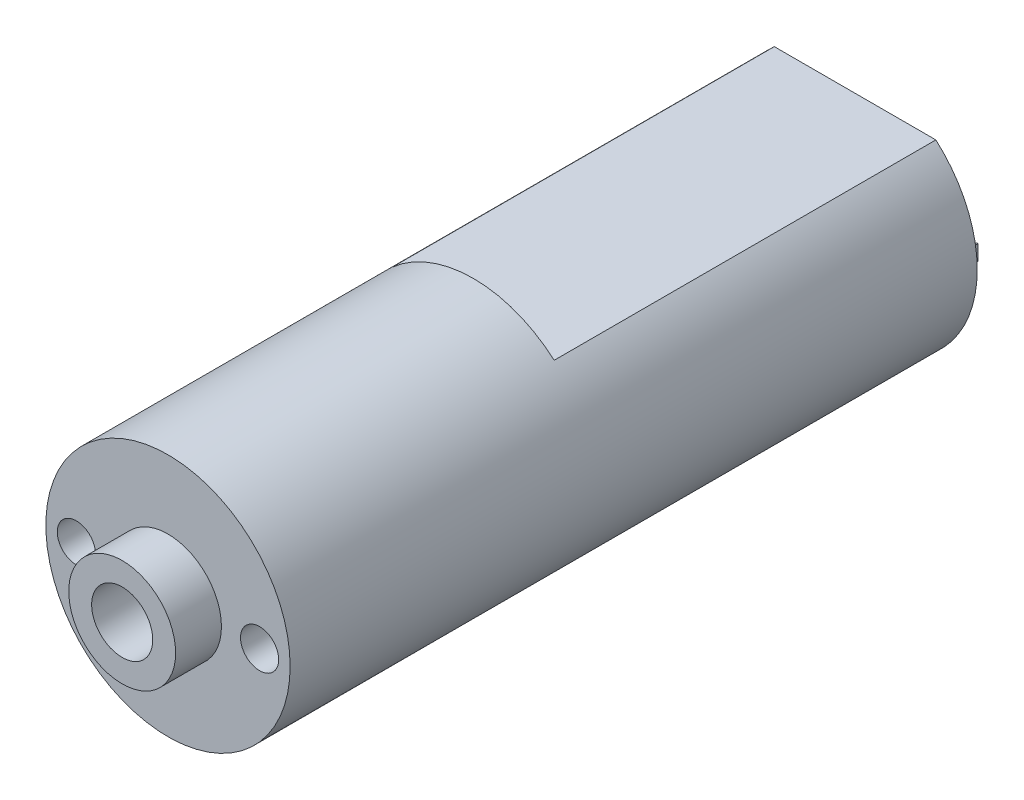
ISO-10303-21;
HEADER;
FILE_DESCRIPTION(('STEP AP214'),'2;1');
FILE_NAME('part.step','',(''),(''),'','','');
FILE_SCHEMA(('AUTOMOTIVE_DESIGN { 1 0 10303 214 1 1 1 1 }'));
ENDSEC;
DATA;
#1=APPLICATION_CONTEXT('core data for automotive mechanical design processes');
#2=APPLICATION_PROTOCOL_DEFINITION('international standard','automotive_design',2000,#1);
#3=PRODUCT_CONTEXT('',#1,'mechanical');
#4=PRODUCT('Part','Part','',(#3));
#5=PRODUCT_RELATED_PRODUCT_CATEGORY('part','',(#4));
#6=PRODUCT_DEFINITION_FORMATION('','',#4);
#7=PRODUCT_DEFINITION_CONTEXT('part definition',#1,'design');
#8=PRODUCT_DEFINITION('design','',#6,#7);
#9=PRODUCT_DEFINITION_SHAPE('','',#8);
#10=(LENGTH_UNIT() NAMED_UNIT(*) SI_UNIT(.MILLI.,.METRE.));
#11=(NAMED_UNIT(*) PLANE_ANGLE_UNIT() SI_UNIT($,.RADIAN.));
#12=(NAMED_UNIT(*) SI_UNIT($,.STERADIAN.) SOLID_ANGLE_UNIT());
#13=UNCERTAINTY_MEASURE_WITH_UNIT(LENGTH_MEASURE(1.E-05),#10,'distance_accuracy_value','');
#14=(GEOMETRIC_REPRESENTATION_CONTEXT(3) GLOBAL_UNCERTAINTY_ASSIGNED_CONTEXT((#13)) GLOBAL_UNIT_ASSIGNED_CONTEXT((#10,
#11,#12)) REPRESENTATION_CONTEXT('',''));
#15=CARTESIAN_POINT('',(0.,0.,0.));
#16=DIRECTION('',(0.,0.,1.));
#17=DIRECTION('',(1.,0.,0.));
#18=AXIS2_PLACEMENT_3D('',#15,#16,#17);
#19=CARTESIAN_POINT('',(0.,0.,-45.));
#20=DIRECTION('',(0.,0.,-1.));
#21=DIRECTION('',(-1.,0.,0.));
#22=AXIS2_PLACEMENT_3D('',#19,#20,#21);
#23=PLANE('',#22);
#24=CARTESIAN_POINT('',(0.,0.,-45.));
#25=DIRECTION('',(0.,0.,-1.));
#26=DIRECTION('',(-1.,0.,0.));
#27=AXIS2_PLACEMENT_3D('',#24,#25,#26);
#28=CIRCLE('',#27,2.);
#29=CARTESIAN_POINT('',(-2.,0.,-45.));
#30=VERTEX_POINT('',#29);
#31=EDGE_CURVE('E44',#30,#30,#28,.T.);
#32=ORIENTED_EDGE('',*,*,#31,.F.);
#33=EDGE_LOOP('',(#32));
#34=FACE_BOUND('',#33,.T.);
#35=CARTESIAN_POINT('',(0.,0.,-45.));
#36=DIRECTION('',(0.,0.,-1.));
#37=DIRECTION('',(-1.,0.,0.));
#38=AXIS2_PLACEMENT_3D('',#35,#36,#37);
#39=CIRCLE('',#38,8.);
#40=CARTESIAN_POINT('',(5.29150262212918,6.,-45.));
#41=VERTEX_POINT('',#40);
#42=CARTESIAN_POINT('',(5.29150262212918,-6.,-45.));
#43=VERTEX_POINT('',#42);
#44=EDGE_CURVE('E186',#41,#43,#39,.T.);
#45=ORIENTED_EDGE('',*,*,#44,.T.);
#46=DIRECTION('',(-1.,0.,0.));
#47=VECTOR('',#46,1.);
#48=CARTESIAN_POINT('',(5.29150262212918,-6.,-45.));
#49=LINE('',#48,#47);
#50=CARTESIAN_POINT('',(-5.29150262212918,-6.,-45.));
#51=VERTEX_POINT('',#50);
#52=EDGE_CURVE('E189',#43,#51,#49,.T.);
#53=ORIENTED_EDGE('',*,*,#52,.T.);
#54=CARTESIAN_POINT('',(0.,0.,-45.));
#55=DIRECTION('',(0.,0.,-1.));
#56=DIRECTION('',(-1.,0.,0.));
#57=AXIS2_PLACEMENT_3D('',#54,#55,#56);
#58=CIRCLE('',#57,8.);
#59=CARTESIAN_POINT('',(-5.29150262212918,6.00000000000001,-45.));
#60=VERTEX_POINT('',#59);
#61=EDGE_CURVE('E192',#51,#60,#58,.T.);
#62=ORIENTED_EDGE('',*,*,#61,.T.);
#63=DIRECTION('',(1.,0.,0.));
#64=VECTOR('',#63,1.);
#65=CARTESIAN_POINT('',(5.29150262212918,6.,-45.));
#66=LINE('',#65,#64);
#67=EDGE_CURVE('E194',#60,#41,#66,.T.);
#68=ORIENTED_EDGE('',*,*,#67,.T.);
#69=EDGE_LOOP('',(#45,#53,#62,#68));
#70=FACE_BOUND('',#69,.T.);
#71=DIRECTION('',(1.,0.,0.));
#72=VECTOR('',#71,1.);
#73=CARTESIAN_POINT('',(-6.95,0.5,-45.));
#74=LINE('',#73,#72);
#75=CARTESIAN_POINT('',(-7.05,0.5,-45.));
#76=VERTEX_POINT('',#75);
#77=CARTESIAN_POINT('',(-6.95,0.5,-45.));
#78=VERTEX_POINT('',#77);
#79=EDGE_CURVE('E154',#76,#78,#74,.T.);
#80=ORIENTED_EDGE('',*,*,#79,.F.);
#81=DIRECTION('',(0.,1.,0.));
#82=VECTOR('',#81,1.);
#83=CARTESIAN_POINT('',(-7.05,0.5,-45.));
#84=LINE('',#83,#82);
#85=CARTESIAN_POINT('',(-7.05,-0.5,-45.));
#86=VERTEX_POINT('',#85);
#87=EDGE_CURVE('E151',#86,#76,#84,.T.);
#88=ORIENTED_EDGE('',*,*,#87,.F.);
#89=DIRECTION('',(-1.,0.,0.));
#90=VECTOR('',#89,1.);
#91=CARTESIAN_POINT('',(-6.95,-0.5,-45.));
#92=LINE('',#91,#90);
#93=CARTESIAN_POINT('',(-6.95,-0.5,-45.));
#94=VERTEX_POINT('',#93);
#95=EDGE_CURVE('E163',#94,#86,#92,.T.);
#96=ORIENTED_EDGE('',*,*,#95,.F.);
#97=DIRECTION('',(0.,-1.,0.));
#98=VECTOR('',#97,1.);
#99=CARTESIAN_POINT('',(-6.95,0.5,-45.));
#100=LINE('',#99,#98);
#101=EDGE_CURVE('E171',#78,#94,#100,.T.);
#102=ORIENTED_EDGE('',*,*,#101,.F.);
#103=EDGE_LOOP('',(#80,#88,#96,#102));
#104=FACE_BOUND('',#103,.T.);
#105=DIRECTION('',(1.,0.,0.));
#106=VECTOR('',#105,1.);
#107=CARTESIAN_POINT('',(6.95,0.5,-45.));
#108=LINE('',#107,#106);
#109=CARTESIAN_POINT('',(6.95,0.5,-45.));
#110=VERTEX_POINT('',#109);
#111=CARTESIAN_POINT('',(7.05,0.5,-45.));
#112=VERTEX_POINT('',#111);
#113=EDGE_CURVE('E552',#110,#112,#108,.T.);
#114=ORIENTED_EDGE('',*,*,#113,.F.);
#115=DIRECTION('',(0.,1.,0.));
#116=VECTOR('',#115,1.);
#117=CARTESIAN_POINT('',(6.95,0.5,-45.));
#118=LINE('',#117,#116);
#119=CARTESIAN_POINT('',(6.95,-0.5,-45.));
#120=VERTEX_POINT('',#119);
#121=EDGE_CURVE('E149',#120,#110,#118,.T.);
#122=ORIENTED_EDGE('',*,*,#121,.F.);
#123=DIRECTION('',(-1.,0.,0.));
#124=VECTOR('',#123,1.);
#125=CARTESIAN_POINT('',(6.95,-0.5,-45.));
#126=LINE('',#125,#124);
#127=CARTESIAN_POINT('',(7.05,-0.5,-45.));
#128=VERTEX_POINT('',#127);
#129=EDGE_CURVE('E145',#128,#120,#126,.T.);
#130=ORIENTED_EDGE('',*,*,#129,.F.);
#131=DIRECTION('',(0.,-1.,0.));
#132=VECTOR('',#131,1.);
#133=CARTESIAN_POINT('',(7.05,0.5,-45.));
#134=LINE('',#133,#132);
#135=EDGE_CURVE('E549',#112,#128,#134,.T.);
#136=ORIENTED_EDGE('',*,*,#135,.F.);
#137=EDGE_LOOP('',(#114,#122,#130,#136));
#138=FACE_BOUND('',#137,.T.);
#139=ADVANCED_FACE('F36',(#34,#70,#104,#138),#23,.T.);
#140=CARTESIAN_POINT('',(0.,0.,-20.));
#141=DIRECTION('',(0.,0.,1.));
#142=DIRECTION('',(1.,0.,0.));
#143=AXIS2_PLACEMENT_3D('',#140,#141,#142);
#144=PLANE('',#143);
#145=DIRECTION('',(1.,0.,0.));
#146=VECTOR('',#145,1.);
#147=CARTESIAN_POINT('',(5.29150262212918,6.,-20.));
#148=LINE('',#147,#146);
#149=CARTESIAN_POINT('',(-5.29150262212917,6.00000000000001,-20.));
#150=VERTEX_POINT('',#149);
#151=CARTESIAN_POINT('',(5.29150262212918,6.,-20.));
#152=VERTEX_POINT('',#151);
#153=EDGE_CURVE('E190',#150,#152,#148,.T.);
#154=ORIENTED_EDGE('',*,*,#153,.F.);
#155=CARTESIAN_POINT('',(0.,0.,-20.));
#156=DIRECTION('',(0.,0.,1.));
#157=DIRECTION('',(1.,0.,0.));
#158=AXIS2_PLACEMENT_3D('',#155,#156,#157);
#159=CIRCLE('',#158,8.);
#160=EDGE_CURVE('E185',#152,#150,#159,.T.);
#161=ORIENTED_EDGE('',*,*,#160,.F.);
#162=EDGE_LOOP('',(#154,#161));
#163=FACE_BOUND('',#162,.T.);
#164=ADVANCED_FACE('F260',(#163),#144,.F.);
#165=DIRECTION('',(-1.,0.,0.));
#166=VECTOR('',#165,1.);
#167=CARTESIAN_POINT('',(5.29150262212918,-6.,-20.));
#168=LINE('',#167,#166);
#169=CARTESIAN_POINT('',(5.29150262212918,-6.,-20.));
#170=VERTEX_POINT('',#169);
#171=CARTESIAN_POINT('',(-5.29150262212918,-6.,-20.));
#172=VERTEX_POINT('',#171);
#173=EDGE_CURVE('E182',#170,#172,#168,.T.);
#174=ORIENTED_EDGE('',*,*,#173,.F.);
#175=EDGE_CURVE('E232',#172,#170,#159,.T.);
#176=ORIENTED_EDGE('',*,*,#175,.F.);
#177=EDGE_LOOP('',(#174,#176));
#178=FACE_BOUND('',#177,.T.);
#179=ADVANCED_FACE('F266',(#178),#144,.F.);
#180=CARTESIAN_POINT('',(-6.,0.,-20.));
#181=DIRECTION('',(0.,0.,1.));
#182=DIRECTION('',(1.,0.,0.));
#183=AXIS2_PLACEMENT_3D('',#180,#181,#182);
#184=CYLINDRICAL_SURFACE('',#183,1.25);
#185=CARTESIAN_POINT('',(-6.,0.,-20.));
#186=DIRECTION('',(0.,0.,1.));
#187=DIRECTION('',(1.,0.,0.));
#188=AXIS2_PLACEMENT_3D('',#185,#186,#187);
#189=CIRCLE('',#188,1.25);
#190=CARTESIAN_POINT('',(-4.75,0.,-20.));
#191=VERTEX_POINT('',#190);
#192=EDGE_CURVE('E229',#191,#191,#189,.T.);
#193=ORIENTED_EDGE('',*,*,#192,.F.);
#194=EDGE_LOOP('',(#193));
#195=FACE_BOUND('',#194,.T.);
#196=CARTESIAN_POINT('',(-6.,0.,0.));
#197=DIRECTION('',(0.,0.,1.));
#198=DIRECTION('',(1.,0.,0.));
#199=AXIS2_PLACEMENT_3D('',#196,#197,#198);
#200=CIRCLE('',#199,1.25);
#201=CARTESIAN_POINT('',(-4.75,0.,0.));
#202=VERTEX_POINT('',#201);
#203=EDGE_CURVE('E237',#202,#202,#200,.T.);
#204=ORIENTED_EDGE('',*,*,#203,.T.);
#205=EDGE_LOOP('',(#204));
#206=FACE_BOUND('',#205,.T.);
#207=ADVANCED_FACE('F305',(#195,#206),#184,.F.);
#208=CARTESIAN_POINT('',(6.,0.,-20.));
#209=DIRECTION('',(0.,0.,1.));
#210=DIRECTION('',(1.,0.,0.));
#211=AXIS2_PLACEMENT_3D('',#208,#209,#210);
#212=CYLINDRICAL_SURFACE('',#211,1.25);
#213=CARTESIAN_POINT('',(6.,0.,-20.));
#214=DIRECTION('',(0.,0.,1.));
#215=DIRECTION('',(1.,0.,0.));
#216=AXIS2_PLACEMENT_3D('',#213,#214,#215);
#217=CIRCLE('',#216,1.25);
#218=CARTESIAN_POINT('',(7.25,0.,-20.));
#219=VERTEX_POINT('',#218);
#220=EDGE_CURVE('E225',#219,#219,#217,.T.);
#221=ORIENTED_EDGE('',*,*,#220,.F.);
#222=EDGE_LOOP('',(#221));
#223=FACE_BOUND('',#222,.T.);
#224=CARTESIAN_POINT('',(6.,0.,0.));
#225=DIRECTION('',(0.,0.,1.));
#226=DIRECTION('',(1.,0.,0.));
#227=AXIS2_PLACEMENT_3D('',#224,#225,#226);
#228=CIRCLE('',#227,1.25);
#229=CARTESIAN_POINT('',(7.25,0.,0.));
#230=VERTEX_POINT('',#229);
#231=EDGE_CURVE('E219',#230,#230,#228,.T.);
#232=ORIENTED_EDGE('',*,*,#231,.T.);
#233=EDGE_LOOP('',(#232));
#234=FACE_BOUND('',#233,.T.);
#235=ADVANCED_FACE('F256',(#223,#234),#212,.F.);
#236=CARTESIAN_POINT('',(0.,0.,-20.));
#237=DIRECTION('',(0.,0.,1.));
#238=DIRECTION('',(1.,0.,0.));
#239=AXIS2_PLACEMENT_3D('',#236,#237,#238);
#240=CYLINDRICAL_SURFACE('',#239,2.);
#241=CARTESIAN_POINT('',(0.,0.,-20.));
#242=DIRECTION('',(0.,0.,1.));
#243=DIRECTION('',(1.,0.,0.));
#244=AXIS2_PLACEMENT_3D('',#241,#242,#243);
#245=CIRCLE('',#244,2.);
#246=CARTESIAN_POINT('',(2.,0.,-20.));
#247=VERTEX_POINT('',#246);
#248=EDGE_CURVE('E222',#247,#247,#245,.T.);
#249=ORIENTED_EDGE('',*,*,#248,.F.);
#250=EDGE_LOOP('',(#249));
#251=FACE_BOUND('',#250,.T.);
#252=CARTESIAN_POINT('',(0.,0.,3.));
#253=DIRECTION('',(0.,0.,1.));
#254=DIRECTION('',(1.,0.,0.));
#255=AXIS2_PLACEMENT_3D('',#252,#253,#254);
#256=CIRCLE('',#255,2.);
#257=CARTESIAN_POINT('',(2.,0.,3.));
#258=VERTEX_POINT('',#257);
#259=EDGE_CURVE('E213',#258,#258,#256,.T.);
#260=ORIENTED_EDGE('',*,*,#259,.T.);
#261=EDGE_LOOP('',(#260));
#262=FACE_BOUND('',#261,.T.);
#263=ADVANCED_FACE('F246',(#251,#262),#240,.F.);
#264=CARTESIAN_POINT('',(0.,0.,-20.));
#265=DIRECTION('',(0.,0.,1.));
#266=DIRECTION('',(1.,0.,0.));
#267=AXIS2_PLACEMENT_3D('',#264,#265,#266);
#268=CYLINDRICAL_SURFACE('',#267,8.);
#269=ORIENTED_EDGE('',*,*,#160,.T.);
#270=DIRECTION('',(0.,0.,1.));
#271=VECTOR('',#270,1.);
#272=CARTESIAN_POINT('',(-5.29150262212918,6.00000000000001,-45.));
#273=LINE('',#272,#271);
#274=EDGE_CURVE('E203',#60,#150,#273,.T.);
#275=ORIENTED_EDGE('',*,*,#274,.F.);
#276=ORIENTED_EDGE('',*,*,#61,.F.);
#277=DIRECTION('',(0.,0.,1.));
#278=VECTOR('',#277,1.);
#279=CARTESIAN_POINT('',(-5.29150262212918,-6.,-45.));
#280=LINE('',#279,#278);
#281=EDGE_CURVE('E206',#51,#172,#280,.T.);
#282=ORIENTED_EDGE('',*,*,#281,.T.);
#283=ORIENTED_EDGE('',*,*,#175,.T.);
#284=DIRECTION('',(0.,0.,1.));
#285=VECTOR('',#284,1.);
#286=CARTESIAN_POINT('',(5.29150262212918,-6.,-45.));
#287=LINE('',#286,#285);
#288=EDGE_CURVE('E209',#43,#170,#287,.T.);
#289=ORIENTED_EDGE('',*,*,#288,.F.);
#290=ORIENTED_EDGE('',*,*,#44,.F.);
#291=DIRECTION('',(0.,0.,1.));
#292=VECTOR('',#291,1.);
#293=CARTESIAN_POINT('',(5.29150262212918,6.,-45.));
#294=LINE('',#293,#292);
#295=EDGE_CURVE('E196',#41,#152,#294,.T.);
#296=ORIENTED_EDGE('',*,*,#295,.T.);
#297=EDGE_LOOP('',(#269,#275,#276,#282,#283,#289,#290,#296));
#298=FACE_BOUND('',#297,.T.);
#299=CARTESIAN_POINT('',(0.,0.,0.));
#300=DIRECTION('',(0.,0.,1.));
#301=DIRECTION('',(1.,0.,0.));
#302=AXIS2_PLACEMENT_3D('',#299,#300,#301);
#303=CIRCLE('',#302,8.);
#304=CARTESIAN_POINT('',(8.,0.,0.));
#305=VERTEX_POINT('',#304);
#306=EDGE_CURVE('E226',#305,#305,#303,.T.);
#307=ORIENTED_EDGE('',*,*,#306,.F.);
#308=EDGE_LOOP('',(#307));
#309=FACE_BOUND('',#308,.T.);
#310=ADVANCED_FACE('F244',(#298,#309),#268,.T.);
#311=CARTESIAN_POINT('',(0.,0.,0.));
#312=DIRECTION('',(0.,0.,1.));
#313=DIRECTION('',(1.,0.,0.));
#314=AXIS2_PLACEMENT_3D('',#311,#312,#313);
#315=PLANE('',#314);
#316=CARTESIAN_POINT('',(0.,0.,0.));
#317=DIRECTION('',(0.,0.,1.));
#318=DIRECTION('',(1.,0.,0.));
#319=AXIS2_PLACEMENT_3D('',#316,#317,#318);
#320=CIRCLE('',#319,3.5);
#321=CARTESIAN_POINT('',(3.5,0.,0.));
#322=VERTEX_POINT('',#321);
#323=EDGE_CURVE('E212',#322,#322,#320,.T.);
#324=ORIENTED_EDGE('',*,*,#323,.F.);
#325=EDGE_LOOP('',(#324));
#326=FACE_BOUND('',#325,.T.);
#327=ORIENTED_EDGE('',*,*,#231,.F.);
#328=EDGE_LOOP('',(#327));
#329=FACE_BOUND('',#328,.T.);
#330=ORIENTED_EDGE('',*,*,#203,.F.);
#331=EDGE_LOOP('',(#330));
#332=FACE_BOUND('',#331,.T.);
#333=ORIENTED_EDGE('',*,*,#306,.T.);
#334=EDGE_LOOP('',(#333));
#335=FACE_BOUND('',#334,.T.);
#336=ADVANCED_FACE('F242',(#326,#329,#332,#335),#315,.T.);
#337=CARTESIAN_POINT('',(0.,0.,3.));
#338=DIRECTION('',(0.,0.,-1.));
#339=DIRECTION('',(-1.,0.,0.));
#340=AXIS2_PLACEMENT_3D('',#337,#338,#339);
#341=CYLINDRICAL_SURFACE('',#340,3.5);
#342=CARTESIAN_POINT('',(0.,0.,3.));
#343=DIRECTION('',(0.,0.,1.));
#344=DIRECTION('',(1.,0.,0.));
#345=AXIS2_PLACEMENT_3D('',#342,#343,#344);
#346=CIRCLE('',#345,3.5);
#347=CARTESIAN_POINT('',(3.5,0.,3.));
#348=VERTEX_POINT('',#347);
#349=EDGE_CURVE('E216',#348,#348,#346,.T.);
#350=ORIENTED_EDGE('',*,*,#349,.F.);
#351=EDGE_LOOP('',(#350));
#352=FACE_BOUND('',#351,.T.);
#353=ORIENTED_EDGE('',*,*,#323,.T.);
#354=EDGE_LOOP('',(#353));
#355=FACE_BOUND('',#354,.T.);
#356=ADVANCED_FACE('F253',(#352,#355),#341,.T.);
#357=CARTESIAN_POINT('',(0.,0.,3.));
#358=DIRECTION('',(0.,0.,1.));
#359=DIRECTION('',(1.,0.,0.));
#360=AXIS2_PLACEMENT_3D('',#357,#358,#359);
#361=PLANE('',#360);
#362=ORIENTED_EDGE('',*,*,#259,.F.);
#363=EDGE_LOOP('',(#362));
#364=FACE_BOUND('',#363,.T.);
#365=ORIENTED_EDGE('',*,*,#349,.T.);
#366=EDGE_LOOP('',(#365));
#367=FACE_BOUND('',#366,.T.);
#368=ADVANCED_FACE('F285',(#364,#367),#361,.T.);
#369=CARTESIAN_POINT('',(5.29150262212918,6.,-45.));
#370=DIRECTION('',(0.,-1.,0.));
#371=DIRECTION('',(1.,0.,0.));
#372=AXIS2_PLACEMENT_3D('',#369,#370,#371);
#373=PLANE('',#372);
#374=ORIENTED_EDGE('',*,*,#153,.T.);
#375=ORIENTED_EDGE('',*,*,#295,.F.);
#376=ORIENTED_EDGE('',*,*,#67,.F.);
#377=ORIENTED_EDGE('',*,*,#274,.T.);
#378=EDGE_LOOP('',(#374,#375,#376,#377));
#379=FACE_BOUND('',#378,.T.);
#380=ADVANCED_FACE('F281',(#379),#373,.F.);
#381=CARTESIAN_POINT('',(5.29150262212918,-6.,-45.));
#382=DIRECTION('',(0.,1.,0.));
#383=DIRECTION('',(0.,0.,1.));
#384=AXIS2_PLACEMENT_3D('',#381,#382,#383);
#385=PLANE('',#384);
#386=ORIENTED_EDGE('',*,*,#173,.T.);
#387=ORIENTED_EDGE('',*,*,#281,.F.);
#388=ORIENTED_EDGE('',*,*,#52,.F.);
#389=ORIENTED_EDGE('',*,*,#288,.T.);
#390=EDGE_LOOP('',(#386,#387,#388,#389));
#391=FACE_BOUND('',#390,.T.);
#392=ADVANCED_FACE('F284',(#391),#385,.F.);
#393=CARTESIAN_POINT('',(0.,0.,-20.));
#394=DIRECTION('',(0.,0.,-1.));
#395=DIRECTION('',(-1.,0.,0.));
#396=AXIS2_PLACEMENT_3D('',#393,#394,#395);
#397=PLANE('',#396);
#398=ORIENTED_EDGE('',*,*,#192,.T.);
#399=EDGE_LOOP('',(#398));
#400=FACE_BOUND('',#399,.T.);
#401=ADVANCED_FACE('F280',(#400),#397,.F.);
#402=ORIENTED_EDGE('',*,*,#220,.T.);
#403=EDGE_LOOP('',(#402));
#404=FACE_BOUND('',#403,.T.);
#405=ADVANCED_FACE('F278',(#404),#397,.F.);
#406=ORIENTED_EDGE('',*,*,#248,.T.);
#407=EDGE_LOOP('',(#406));
#408=FACE_BOUND('',#407,.T.);
#409=ADVANCED_FACE('F275',(#408),#397,.F.);
#410=CARTESIAN_POINT('',(0.,0.,-46.));
#411=DIRECTION('',(0.,0.,-1.));
#412=DIRECTION('',(-1.,0.,0.));
#413=AXIS2_PLACEMENT_3D('',#410,#411,#412);
#414=PLANE('',#413);
#415=CARTESIAN_POINT('',(0.,0.,-46.));
#416=DIRECTION('',(0.,0.,-1.));
#417=DIRECTION('',(-1.,0.,0.));
#418=AXIS2_PLACEMENT_3D('',#415,#416,#417);
#419=CIRCLE('',#418,1.);
#420=CARTESIAN_POINT('',(-1.,0.,-46.));
#421=VERTEX_POINT('',#420);
#422=EDGE_CURVE('E11',#421,#421,#419,.T.);
#423=ORIENTED_EDGE('',*,*,#422,.T.);
#424=EDGE_LOOP('',(#423));
#425=FACE_BOUND('',#424,.T.);
#426=ADVANCED_FACE('F273',(#425),#414,.T.);
#427=CARTESIAN_POINT('',(-7.05,0.5,-46.));
#428=DIRECTION('',(1.,0.,0.));
#429=DIRECTION('',(0.,0.,-1.));
#430=AXIS2_PLACEMENT_3D('',#427,#428,#429);
#431=PLANE('',#430);
#432=ORIENTED_EDGE('',*,*,#87,.T.);
#433=DIRECTION('',(0.,0.,1.));
#434=VECTOR('',#433,1.);
#435=CARTESIAN_POINT('',(-7.05,0.5,-46.));
#436=LINE('',#435,#434);
#437=CARTESIAN_POINT('',(-7.05,0.5,-46.));
#438=VERTEX_POINT('',#437);
#439=EDGE_CURVE('E180',#438,#76,#436,.T.);
#440=ORIENTED_EDGE('',*,*,#439,.F.);
#441=DIRECTION('',(0.,1.,0.));
#442=VECTOR('',#441,1.);
#443=CARTESIAN_POINT('',(-7.05,0.5,-46.));
#444=LINE('',#443,#442);
#445=CARTESIAN_POINT('',(-7.05,-0.5,-46.));
#446=VERTEX_POINT('',#445);
#447=EDGE_CURVE('E159',#446,#438,#444,.T.);
#448=ORIENTED_EDGE('',*,*,#447,.F.);
#449=DIRECTION('',(0.,0.,1.));
#450=VECTOR('',#449,1.);
#451=CARTESIAN_POINT('',(-7.05,-0.5,-46.));
#452=LINE('',#451,#450);
#453=EDGE_CURVE('E168',#446,#86,#452,.T.);
#454=ORIENTED_EDGE('',*,*,#453,.T.);
#455=EDGE_LOOP('',(#432,#440,#448,#454));
#456=FACE_BOUND('',#455,.T.);
#457=ADVANCED_FACE('F336',(#456),#431,.F.);
#458=CARTESIAN_POINT('',(-6.95,0.5,-46.));
#459=DIRECTION('',(0.,-1.,0.));
#460=DIRECTION('',(0.,0.,-1.));
#461=AXIS2_PLACEMENT_3D('',#458,#459,#460);
#462=PLANE('',#461);
#463=ORIENTED_EDGE('',*,*,#79,.T.);
#464=DIRECTION('',(0.,0.,1.));
#465=VECTOR('',#464,1.);
#466=CARTESIAN_POINT('',(-6.95,0.5,-46.));
#467=LINE('',#466,#465);
#468=CARTESIAN_POINT('',(-6.95,0.5,-46.));
#469=VERTEX_POINT('',#468);
#470=EDGE_CURVE('E177',#469,#78,#467,.T.);
#471=ORIENTED_EDGE('',*,*,#470,.F.);
#472=DIRECTION('',(1.,0.,0.));
#473=VECTOR('',#472,1.);
#474=CARTESIAN_POINT('',(-6.95,0.5,-46.));
#475=LINE('',#474,#473);
#476=EDGE_CURVE('E162',#438,#469,#475,.T.);
#477=ORIENTED_EDGE('',*,*,#476,.F.);
#478=ORIENTED_EDGE('',*,*,#439,.T.);
#479=EDGE_LOOP('',(#463,#471,#477,#478));
#480=FACE_BOUND('',#479,.T.);
#481=ADVANCED_FACE('F345',(#480),#462,.F.);
#482=CARTESIAN_POINT('',(-6.95,0.5,-46.));
#483=DIRECTION('',(-1.,0.,0.));
#484=DIRECTION('',(0.,0.,1.));
#485=AXIS2_PLACEMENT_3D('',#482,#483,#484);
#486=PLANE('',#485);
#487=ORIENTED_EDGE('',*,*,#101,.T.);
#488=DIRECTION('',(0.,0.,1.));
#489=VECTOR('',#488,1.);
#490=CARTESIAN_POINT('',(-6.95,-0.5,-46.));
#491=LINE('',#490,#489);
#492=CARTESIAN_POINT('',(-6.95,-0.5,-46.));
#493=VERTEX_POINT('',#492);
#494=EDGE_CURVE('E59',#493,#94,#491,.T.);
#495=ORIENTED_EDGE('',*,*,#494,.F.);
#496=DIRECTION('',(0.,-1.,0.));
#497=VECTOR('',#496,1.);
#498=CARTESIAN_POINT('',(-6.95,0.5,-46.));
#499=LINE('',#498,#497);
#500=EDGE_CURVE('E165',#469,#493,#499,.T.);
#501=ORIENTED_EDGE('',*,*,#500,.F.);
#502=ORIENTED_EDGE('',*,*,#470,.T.);
#503=EDGE_LOOP('',(#487,#495,#501,#502));
#504=FACE_BOUND('',#503,.T.);
#505=ADVANCED_FACE('F352',(#504),#486,.F.);
#506=CARTESIAN_POINT('',(-6.95,-0.5,-46.));
#507=DIRECTION('',(0.,1.,0.));
#508=DIRECTION('',(0.,0.,1.));
#509=AXIS2_PLACEMENT_3D('',#506,#507,#508);
#510=PLANE('',#509);
#511=ORIENTED_EDGE('',*,*,#95,.T.);
#512=ORIENTED_EDGE('',*,*,#453,.F.);
#513=DIRECTION('',(-1.,0.,0.));
#514=VECTOR('',#513,1.);
#515=CARTESIAN_POINT('',(-6.95,-0.5,-46.));
#516=LINE('',#515,#514);
#517=EDGE_CURVE('E167',#493,#446,#516,.T.);
#518=ORIENTED_EDGE('',*,*,#517,.F.);
#519=ORIENTED_EDGE('',*,*,#494,.T.);
#520=EDGE_LOOP('',(#511,#512,#518,#519));
#521=FACE_BOUND('',#520,.T.);
#522=ADVANCED_FACE('F360',(#521),#510,.F.);
#523=CARTESIAN_POINT('',(0.,0.,-46.));
#524=DIRECTION('',(0.,0.,-1.));
#525=DIRECTION('',(-1.,0.,0.));
#526=AXIS2_PLACEMENT_3D('',#523,#524,#525);
#527=PLANE('',#526);
#528=ORIENTED_EDGE('',*,*,#447,.T.);
#529=ORIENTED_EDGE('',*,*,#476,.T.);
#530=ORIENTED_EDGE('',*,*,#500,.T.);
#531=ORIENTED_EDGE('',*,*,#517,.T.);
#532=EDGE_LOOP('',(#528,#529,#530,#531));
#533=FACE_BOUND('',#532,.T.);
#534=ADVANCED_FACE('F368',(#533),#527,.T.);
#535=CARTESIAN_POINT('',(6.95,0.5,-46.));
#536=DIRECTION('',(1.,0.,0.));
#537=DIRECTION('',(0.,0.,-1.));
#538=AXIS2_PLACEMENT_3D('',#535,#536,#537);
#539=PLANE('',#538);
#540=ORIENTED_EDGE('',*,*,#121,.T.);
#541=DIRECTION('',(0.,0.,1.));
#542=VECTOR('',#541,1.);
#543=CARTESIAN_POINT('',(6.95,0.5,-46.));
#544=LINE('',#543,#542);
#545=CARTESIAN_POINT('',(6.95,0.5,-46.));
#546=VERTEX_POINT('',#545);
#547=EDGE_CURVE('E130',#546,#110,#544,.T.);
#548=ORIENTED_EDGE('',*,*,#547,.F.);
#549=DIRECTION('',(0.,1.,0.));
#550=VECTOR('',#549,1.);
#551=CARTESIAN_POINT('',(6.95,0.5,-46.));
#552=LINE('',#551,#550);
#553=CARTESIAN_POINT('',(6.95,-0.5,-46.));
#554=VERTEX_POINT('',#553);
#555=EDGE_CURVE('E137',#554,#546,#552,.T.);
#556=ORIENTED_EDGE('',*,*,#555,.F.);
#557=DIRECTION('',(0.,0.,1.));
#558=VECTOR('',#557,1.);
#559=CARTESIAN_POINT('',(6.95,-0.5,-46.));
#560=LINE('',#559,#558);
#561=EDGE_CURVE('E546',#554,#120,#560,.T.);
#562=ORIENTED_EDGE('',*,*,#561,.T.);
#563=EDGE_LOOP('',(#540,#548,#556,#562));
#564=FACE_BOUND('',#563,.T.);
#565=ADVANCED_FACE('F147',(#564),#539,.F.);
#566=CARTESIAN_POINT('',(6.95,0.5,-46.));
#567=DIRECTION('',(0.,-1.,0.));
#568=DIRECTION('',(0.,0.,-1.));
#569=AXIS2_PLACEMENT_3D('',#566,#567,#568);
#570=PLANE('',#569);
#571=ORIENTED_EDGE('',*,*,#113,.T.);
#572=DIRECTION('',(0.,0.,1.));
#573=VECTOR('',#572,1.);
#574=CARTESIAN_POINT('',(7.05,0.5,-46.));
#575=LINE('',#574,#573);
#576=CARTESIAN_POINT('',(7.05,0.5,-46.));
#577=VERTEX_POINT('',#576);
#578=EDGE_CURVE('E133',#577,#112,#575,.T.);
#579=ORIENTED_EDGE('',*,*,#578,.F.);
#580=DIRECTION('',(1.,0.,0.));
#581=VECTOR('',#580,1.);
#582=CARTESIAN_POINT('',(6.95,0.5,-46.));
#583=LINE('',#582,#581);
#584=EDGE_CURVE('E126',#546,#577,#583,.T.);
#585=ORIENTED_EDGE('',*,*,#584,.F.);
#586=ORIENTED_EDGE('',*,*,#547,.T.);
#587=EDGE_LOOP('',(#571,#579,#585,#586));
#588=FACE_BOUND('',#587,.T.);
#589=ADVANCED_FACE('F128',(#588),#570,.F.);
#590=CARTESIAN_POINT('',(7.05,0.5,-46.));
#591=DIRECTION('',(-1.,0.,0.));
#592=DIRECTION('',(0.,0.,1.));
#593=AXIS2_PLACEMENT_3D('',#590,#591,#592);
#594=PLANE('',#593);
#595=ORIENTED_EDGE('',*,*,#135,.T.);
#596=DIRECTION('',(0.,0.,1.));
#597=VECTOR('',#596,1.);
#598=CARTESIAN_POINT('',(7.05,-0.5,-46.));
#599=LINE('',#598,#597);
#600=CARTESIAN_POINT('',(7.05,-0.5,-46.));
#601=VERTEX_POINT('',#600);
#602=EDGE_CURVE('E51',#601,#128,#599,.T.);
#603=ORIENTED_EDGE('',*,*,#602,.F.);
#604=DIRECTION('',(0.,-1.,0.));
#605=VECTOR('',#604,1.);
#606=CARTESIAN_POINT('',(7.05,0.5,-46.));
#607=LINE('',#606,#605);
#608=EDGE_CURVE('E136',#577,#601,#607,.T.);
#609=ORIENTED_EDGE('',*,*,#608,.F.);
#610=ORIENTED_EDGE('',*,*,#578,.T.);
#611=EDGE_LOOP('',(#595,#603,#609,#610));
#612=FACE_BOUND('',#611,.T.);
#613=ADVANCED_FACE('F388',(#612),#594,.F.);
#614=CARTESIAN_POINT('',(6.95,-0.5,-46.));
#615=DIRECTION('',(0.,1.,0.));
#616=DIRECTION('',(0.,0.,1.));
#617=AXIS2_PLACEMENT_3D('',#614,#615,#616);
#618=PLANE('',#617);
#619=ORIENTED_EDGE('',*,*,#129,.T.);
#620=ORIENTED_EDGE('',*,*,#561,.F.);
#621=DIRECTION('',(-1.,0.,0.));
#622=VECTOR('',#621,1.);
#623=CARTESIAN_POINT('',(6.95,-0.5,-46.));
#624=LINE('',#623,#622);
#625=EDGE_CURVE('E141',#601,#554,#624,.T.);
#626=ORIENTED_EDGE('',*,*,#625,.F.);
#627=ORIENTED_EDGE('',*,*,#602,.T.);
#628=EDGE_LOOP('',(#619,#620,#626,#627));
#629=FACE_BOUND('',#628,.T.);
#630=ADVANCED_FACE('F395',(#629),#618,.F.);
#631=CARTESIAN_POINT('',(0.,0.,-46.));
#632=DIRECTION('',(0.,0.,1.));
#633=DIRECTION('',(1.,0.,0.));
#634=AXIS2_PLACEMENT_3D('',#631,#632,#633);
#635=PLANE('',#634);
#636=ORIENTED_EDGE('',*,*,#555,.T.);
#637=ORIENTED_EDGE('',*,*,#584,.T.);
#638=ORIENTED_EDGE('',*,*,#608,.T.);
#639=ORIENTED_EDGE('',*,*,#625,.T.);
#640=EDGE_LOOP('',(#636,#637,#638,#639));
#641=FACE_BOUND('',#640,.T.);
#642=ADVANCED_FACE('F140',(#641),#635,.F.);
#643=CARTESIAN_POINT('',(0.,0.,-45.));
#644=DIRECTION('',(0.,0.,-1.));
#645=DIRECTION('',(-1.,0.,0.));
#646=AXIS2_PLACEMENT_3D('',#643,#644,#645);
#647=DEGENERATE_TOROIDAL_SURFACE('',#646,1.,1.,.T.);
#648=ORIENTED_EDGE('',*,*,#31,.T.);
#649=EDGE_LOOP('',(#648));
#650=FACE_BOUND('',#649,.T.);
#651=ORIENTED_EDGE('',*,*,#422,.F.);
#652=EDGE_LOOP('',(#651));
#653=FACE_BOUND('',#652,.T.);
#654=ADVANCED_FACE('F38',(#650,#653),#647,.T.);
#655=CLOSED_SHELL('',(#139,#164,#179,#207,#235,#263,#310,#336,#356,#368,#380,#392,#401,#405,
#409,#426,#457,#481,#505,#522,#534,#565,#589,#613,#630,#642,#654));
#656=MANIFOLD_SOLID_BREP('B2',#655);
#657=ADVANCED_BREP_SHAPE_REPRESENTATION('',(#18,#656),#14);
#658=SHAPE_DEFINITION_REPRESENTATION(#9,#657);
ENDSEC;
END-ISO-10303-21;
